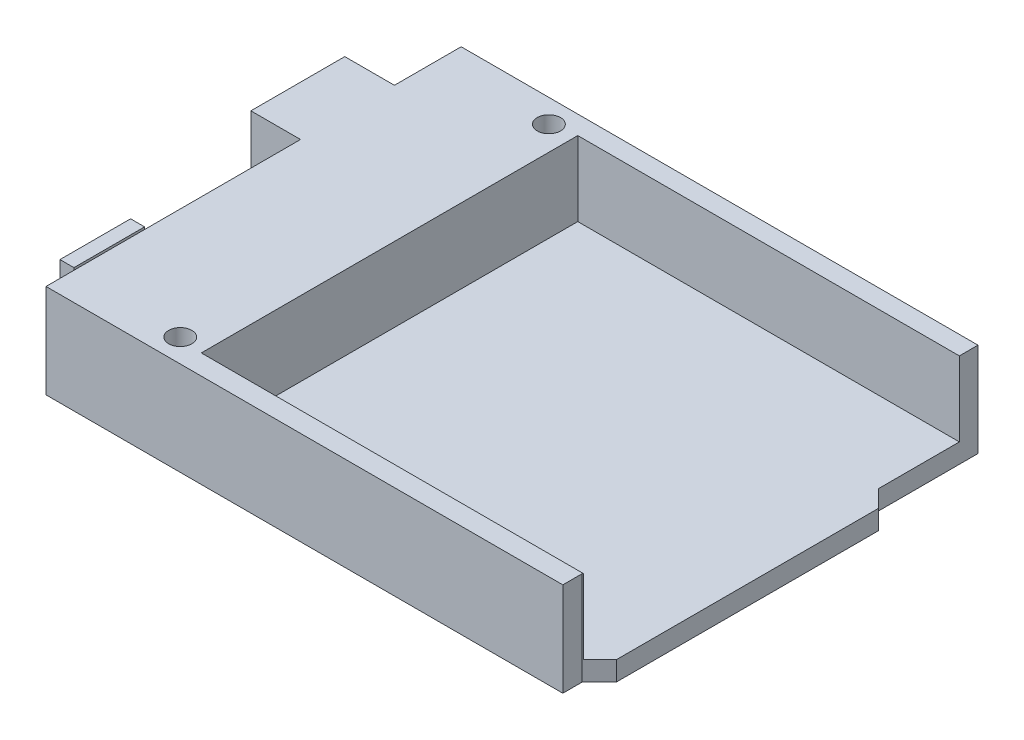
ISO-10303-21;
HEADER;
FILE_DESCRIPTION(('STEP AP214'),'2;1');
FILE_NAME('part.step','',(''),(''),'','','');
FILE_SCHEMA(('AUTOMOTIVE_DESIGN { 1 0 10303 214 1 1 1 1 }'));
ENDSEC;
DATA;
#1=APPLICATION_CONTEXT('core data for automotive mechanical design processes');
#2=APPLICATION_PROTOCOL_DEFINITION('international standard','automotive_design',2000,#1);
#3=PRODUCT_CONTEXT('',#1,'mechanical');
#4=PRODUCT('Part','Part','',(#3));
#5=PRODUCT_RELATED_PRODUCT_CATEGORY('part','',(#4));
#6=PRODUCT_DEFINITION_FORMATION('','',#4);
#7=PRODUCT_DEFINITION_CONTEXT('part definition',#1,'design');
#8=PRODUCT_DEFINITION('design','',#6,#7);
#9=PRODUCT_DEFINITION_SHAPE('','',#8);
#10=(LENGTH_UNIT() NAMED_UNIT(*) SI_UNIT(.MILLI.,.METRE.));
#11=(NAMED_UNIT(*) PLANE_ANGLE_UNIT() SI_UNIT($,.RADIAN.));
#12=(NAMED_UNIT(*) SI_UNIT($,.STERADIAN.) SOLID_ANGLE_UNIT());
#13=UNCERTAINTY_MEASURE_WITH_UNIT(LENGTH_MEASURE(1.E-05),#10,'distance_accuracy_value','');
#14=(GEOMETRIC_REPRESENTATION_CONTEXT(3) GLOBAL_UNCERTAINTY_ASSIGNED_CONTEXT((#13)) GLOBAL_UNIT_ASSIGNED_CONTEXT((#10,
#11,#12)) REPRESENTATION_CONTEXT('',''));
#15=CARTESIAN_POINT('',(0.,0.,0.));
#16=DIRECTION('',(0.,0.,1.));
#17=DIRECTION('',(1.,0.,0.));
#18=AXIS2_PLACEMENT_3D('',#15,#16,#17);
#19=CARTESIAN_POINT('',(0.,12.1,0.));
#20=DIRECTION('',(1.,0.,0.));
#21=DIRECTION('',(0.,0.,-1.));
#22=AXIS2_PLACEMENT_3D('',#19,#20,#21);
#23=PLANE('',#22);
#24=DIRECTION('',(0.,-1.,0.));
#25=VECTOR('',#24,1.);
#26=CARTESIAN_POINT('',(0.,12.4,-12.7));
#27=LINE('',#26,#25);
#28=CARTESIAN_POINT('',(0.,12.1,-12.7));
#29=VERTEX_POINT('',#28);
#30=CARTESIAN_POINT('',(0.,1.5,-12.7));
#31=VERTEX_POINT('',#30);
#32=EDGE_CURVE('E236',#29,#31,#27,.T.);
#33=ORIENTED_EDGE('',*,*,#32,.F.);
#34=DIRECTION('',(0.,0.,1.));
#35=VECTOR('',#34,1.);
#36=CARTESIAN_POINT('',(0.,12.1,0.));
#37=LINE('',#36,#35);
#38=CARTESIAN_POINT('',(0.,12.1,-32.8));
#39=VERTEX_POINT('',#38);
#40=EDGE_CURVE('E340',#39,#29,#37,.T.);
#41=ORIENTED_EDGE('',*,*,#40,.F.);
#42=DIRECTION('',(0.,1.,0.));
#43=VECTOR('',#42,1.);
#44=CARTESIAN_POINT('',(0.,12.1,-32.8));
#45=LINE('',#44,#43);
#46=CARTESIAN_POINT('',(0.,1.5,-32.8));
#47=VERTEX_POINT('',#46);
#48=EDGE_CURVE('E275',#47,#39,#45,.T.);
#49=ORIENTED_EDGE('',*,*,#48,.F.);
#50=DIRECTION('',(0.,0.,1.));
#51=VECTOR('',#50,1.);
#52=CARTESIAN_POINT('',(0.,1.5,-44.9));
#53=LINE('',#52,#51);
#54=CARTESIAN_POINT('',(0.,1.5,-44.9));
#55=VERTEX_POINT('',#54);
#56=EDGE_CURVE('E284',#55,#47,#53,.T.);
#57=ORIENTED_EDGE('',*,*,#56,.F.);
#58=DIRECTION('',(0.,-1.,0.));
#59=VECTOR('',#58,1.);
#60=CARTESIAN_POINT('',(0.,12.1,-44.9));
#61=LINE('',#60,#59);
#62=CARTESIAN_POINT('',(0.,12.1,-44.9));
#63=VERTEX_POINT('',#62);
#64=EDGE_CURVE('E270',#63,#55,#61,.T.);
#65=ORIENTED_EDGE('',*,*,#64,.F.);
#66=CARTESIAN_POINT('',(0.,12.1,-53.5));
#67=VERTEX_POINT('',#66);
#68=EDGE_CURVE('E336',#67,#63,#37,.T.);
#69=ORIENTED_EDGE('',*,*,#68,.F.);
#70=DIRECTION('',(0.,-1.,0.));
#71=VECTOR('',#70,1.);
#72=CARTESIAN_POINT('',(0.,12.1,-53.5));
#73=LINE('',#72,#71);
#74=CARTESIAN_POINT('',(0.,0.,-53.5));
#75=VERTEX_POINT('',#74);
#76=EDGE_CURVE('E346',#67,#75,#73,.T.);
#77=ORIENTED_EDGE('',*,*,#76,.T.);
#78=DIRECTION('',(0.,0.,1.));
#79=VECTOR('',#78,1.);
#80=CARTESIAN_POINT('',(0.,0.,0.));
#81=LINE('',#80,#79);
#82=CARTESIAN_POINT('',(0.,0.,0.));
#83=VERTEX_POINT('',#82);
#84=EDGE_CURVE('E321',#75,#83,#81,.T.);
#85=ORIENTED_EDGE('',*,*,#84,.T.);
#86=DIRECTION('',(0.,-1.,0.));
#87=VECTOR('',#86,1.);
#88=CARTESIAN_POINT('',(0.,12.1,0.));
#89=LINE('',#88,#87);
#90=CARTESIAN_POINT('',(0.,12.1,0.));
#91=VERTEX_POINT('',#90);
#92=EDGE_CURVE('E359',#91,#83,#89,.T.);
#93=ORIENTED_EDGE('',*,*,#92,.F.);
#94=CARTESIAN_POINT('',(0.,12.1,-3.6));
#95=VERTEX_POINT('',#94);
#96=EDGE_CURVE('E341',#95,#91,#37,.T.);
#97=ORIENTED_EDGE('',*,*,#96,.F.);
#98=DIRECTION('',(0.,1.,0.));
#99=VECTOR('',#98,1.);
#100=CARTESIAN_POINT('',(0.,12.4,-3.6));
#101=LINE('',#100,#99);
#102=CARTESIAN_POINT('',(0.,1.5,-3.6));
#103=VERTEX_POINT('',#102);
#104=EDGE_CURVE('E65',#103,#95,#101,.T.);
#105=ORIENTED_EDGE('',*,*,#104,.F.);
#106=DIRECTION('',(0.,0.,1.));
#107=VECTOR('',#106,1.);
#108=CARTESIAN_POINT('',(0.,1.5,-12.7));
#109=LINE('',#108,#107);
#110=EDGE_CURVE('E255',#31,#103,#109,.T.);
#111=ORIENTED_EDGE('',*,*,#110,.F.);
#112=EDGE_LOOP('',(#33,#41,#49,#57,#65,#69,#77,#85,#93,#97,#105,#111));
#113=FACE_BOUND('',#112,.T.);
#114=ADVANCED_FACE('F43',(#113),#23,.F.);
#115=CARTESIAN_POINT('',(0.,12.1,0.));
#116=DIRECTION('',(0.,0.,-1.));
#117=DIRECTION('',(-1.,0.,0.));
#118=AXIS2_PLACEMENT_3D('',#115,#116,#117);
#119=PLANE('',#118);
#120=DIRECTION('',(1.,0.,0.));
#121=VECTOR('',#120,1.);
#122=CARTESIAN_POINT('',(0.,0.,0.));
#123=LINE('',#122,#121);
#124=CARTESIAN_POINT('',(66.6,0.,0.));
#125=VERTEX_POINT('',#124);
#126=EDGE_CURVE('E349',#83,#125,#123,.T.);
#127=ORIENTED_EDGE('',*,*,#126,.T.);
#128=DIRECTION('',(0.,1.,0.));
#129=VECTOR('',#128,1.);
#130=CARTESIAN_POINT('',(66.6,-15.1604749265978,0.));
#131=LINE('',#130,#129);
#132=CARTESIAN_POINT('',(66.6,12.1,0.));
#133=VERTEX_POINT('',#132);
#134=EDGE_CURVE('E309',#125,#133,#131,.T.);
#135=ORIENTED_EDGE('',*,*,#134,.T.);
#136=DIRECTION('',(1.,0.,0.));
#137=VECTOR('',#136,1.);
#138=CARTESIAN_POINT('',(0.,12.1,0.));
#139=LINE('',#138,#137);
#140=EDGE_CURVE('E339',#91,#133,#139,.T.);
#141=ORIENTED_EDGE('',*,*,#140,.F.);
#142=ORIENTED_EDGE('',*,*,#92,.T.);
#143=EDGE_LOOP('',(#127,#135,#141,#142));
#144=FACE_BOUND('',#143,.T.);
#145=ADVANCED_FACE('F399',(#144),#119,.F.);
#146=CARTESIAN_POINT('',(68.8,12.1,0.));
#147=DIRECTION('',(-1.,0.,0.));
#148=DIRECTION('',(0.,0.,1.));
#149=AXIS2_PLACEMENT_3D('',#146,#147,#148);
#150=PLANE('',#149);
#151=DIRECTION('',(0.,1.,0.));
#152=VECTOR('',#151,1.);
#153=CARTESIAN_POINT('',(68.8,-15.1604749265978,-38.5));
#154=LINE('',#153,#152);
#155=CARTESIAN_POINT('',(68.8,0.,-38.5));
#156=VERTEX_POINT('',#155);
#157=CARTESIAN_POINT('',(68.8,2.5,-38.5));
#158=VERTEX_POINT('',#157);
#159=EDGE_CURVE('E326',#156,#158,#154,.T.);
#160=ORIENTED_EDGE('',*,*,#159,.T.);
#161=DIRECTION('',(0.,0.,1.));
#162=VECTOR('',#161,1.);
#163=CARTESIAN_POINT('',(68.8,2.5,0.));
#164=LINE('',#163,#162);
#165=CARTESIAN_POINT('',(68.8,2.5,-4.70000000000004));
#166=VERTEX_POINT('',#165);
#167=EDGE_CURVE('E219',#158,#166,#164,.T.);
#168=ORIENTED_EDGE('',*,*,#167,.T.);
#169=DIRECTION('',(0.,1.,0.));
#170=VECTOR('',#169,1.);
#171=CARTESIAN_POINT('',(68.8,-15.1604749265978,-4.70000000000004));
#172=LINE('',#171,#170);
#173=CARTESIAN_POINT('',(68.8,0.,-4.70000000000004));
#174=VERTEX_POINT('',#173);
#175=EDGE_CURVE('E314',#174,#166,#172,.T.);
#176=ORIENTED_EDGE('',*,*,#175,.F.);
#177=DIRECTION('',(0.,0.,-1.));
#178=VECTOR('',#177,1.);
#179=CARTESIAN_POINT('',(68.8,0.,0.));
#180=LINE('',#179,#178);
#181=EDGE_CURVE('E352',#174,#156,#180,.T.);
#182=ORIENTED_EDGE('',*,*,#181,.T.);
#183=EDGE_LOOP('',(#160,#168,#176,#182));
#184=FACE_BOUND('',#183,.T.);
#185=ADVANCED_FACE('F370',(#184),#150,.F.);
#186=CARTESIAN_POINT('',(0.,12.1,-53.5));
#187=DIRECTION('',(0.,0.,1.));
#188=DIRECTION('',(1.,0.,0.));
#189=AXIS2_PLACEMENT_3D('',#186,#187,#188);
#190=PLANE('',#189);
#191=DIRECTION('',(-1.,0.,0.));
#192=VECTOR('',#191,1.);
#193=CARTESIAN_POINT('',(0.,12.1,-53.5));
#194=LINE('',#193,#192);
#195=CARTESIAN_POINT('',(66.6,12.1,-53.5));
#196=VERTEX_POINT('',#195);
#197=EDGE_CURVE('E344',#196,#67,#194,.T.);
#198=ORIENTED_EDGE('',*,*,#197,.F.);
#199=DIRECTION('',(0.,1.,0.));
#200=VECTOR('',#199,1.);
#201=CARTESIAN_POINT('',(66.6,-15.1604749265978,-53.5));
#202=LINE('',#201,#200);
#203=CARTESIAN_POINT('',(66.6,0.,-53.5));
#204=VERTEX_POINT('',#203);
#205=EDGE_CURVE('E330',#204,#196,#202,.T.);
#206=ORIENTED_EDGE('',*,*,#205,.F.);
#207=DIRECTION('',(-1.,0.,0.));
#208=VECTOR('',#207,1.);
#209=CARTESIAN_POINT('',(0.,0.,-53.5));
#210=LINE('',#209,#208);
#211=EDGE_CURVE('E355',#204,#75,#210,.T.);
#212=ORIENTED_EDGE('',*,*,#211,.T.);
#213=ORIENTED_EDGE('',*,*,#76,.F.);
#214=EDGE_LOOP('',(#198,#206,#212,#213));
#215=FACE_BOUND('',#214,.T.);
#216=ADVANCED_FACE('F384',(#215),#190,.F.);
#217=CARTESIAN_POINT('',(0.,12.1,0.));
#218=DIRECTION('',(0.,-1.,0.));
#219=DIRECTION('',(0.,0.,-1.));
#220=AXIS2_PLACEMENT_3D('',#217,#218,#219);
#221=PLANE('',#220);
#222=DIRECTION('',(-0.707106781186539,0.,0.707106781186556));
#223=VECTOR('',#222,1.);
#224=CARTESIAN_POINT('',(32.0500000000008,12.1,32.05));
#225=LINE('',#224,#223);
#226=CARTESIAN_POINT('',(66.6865990462807,12.1,-2.58659904628065));
#227=VERTEX_POINT('',#226);
#228=CARTESIAN_POINT('',(66.6,12.1,-2.5));
#229=VERTEX_POINT('',#228);
#230=EDGE_CURVE('E304',#227,#229,#225,.T.);
#231=ORIENTED_EDGE('',*,*,#230,.F.);
#232=DIRECTION('',(1.,0.,0.));
#233=VECTOR('',#232,1.);
#234=CARTESIAN_POINT('',(17.4249588263836,12.1,-2.58659904628065));
#235=LINE('',#234,#233);
#236=CARTESIAN_POINT('',(17.4249588263836,12.1,-2.58659904628065));
#237=VERTEX_POINT('',#236);
#238=EDGE_CURVE('E57',#237,#227,#235,.T.);
#239=ORIENTED_EDGE('',*,*,#238,.F.);
#240=DIRECTION('',(0.,0.,1.));
#241=VECTOR('',#240,1.);
#242=CARTESIAN_POINT('',(17.4249588263836,12.1,-51.1));
#243=LINE('',#242,#241);
#244=CARTESIAN_POINT('',(17.4249588263836,12.1,-51.1));
#245=VERTEX_POINT('',#244);
#246=EDGE_CURVE('E202',#245,#237,#243,.T.);
#247=ORIENTED_EDGE('',*,*,#246,.F.);
#248=DIRECTION('',(-1.,0.,0.));
#249=VECTOR('',#248,1.);
#250=CARTESIAN_POINT('',(17.4249588263836,12.1,-51.1));
#251=LINE('',#250,#249);
#252=CARTESIAN_POINT('',(66.6,12.1,-51.1));
#253=VERTEX_POINT('',#252);
#254=EDGE_CURVE('E186',#253,#245,#251,.T.);
#255=ORIENTED_EDGE('',*,*,#254,.F.);
#256=DIRECTION('',(0.,0.,1.));
#257=VECTOR('',#256,1.);
#258=CARTESIAN_POINT('',(66.6,12.1,0.));
#259=LINE('',#258,#257);
#260=EDGE_CURVE('E300',#196,#253,#259,.T.);
#261=ORIENTED_EDGE('',*,*,#260,.F.);
#262=ORIENTED_EDGE('',*,*,#197,.T.);
#263=ORIENTED_EDGE('',*,*,#68,.T.);
#264=DIRECTION('',(1.,0.,0.));
#265=VECTOR('',#264,1.);
#266=CARTESIAN_POINT('',(-6.4,12.1,-44.9));
#267=LINE('',#266,#265);
#268=CARTESIAN_POINT('',(-6.4,12.1,-44.9));
#269=VERTEX_POINT('',#268);
#270=EDGE_CURVE('E281',#269,#63,#267,.T.);
#271=ORIENTED_EDGE('',*,*,#270,.F.);
#272=DIRECTION('',(0.,0.,-1.));
#273=VECTOR('',#272,1.);
#274=CARTESIAN_POINT('',(-6.4,12.1,-44.9));
#275=LINE('',#274,#273);
#276=CARTESIAN_POINT('',(-6.4,12.1,-32.8));
#277=VERTEX_POINT('',#276);
#278=EDGE_CURVE('E279',#277,#269,#275,.T.);
#279=ORIENTED_EDGE('',*,*,#278,.F.);
#280=DIRECTION('',(1.,0.,0.));
#281=VECTOR('',#280,1.);
#282=CARTESIAN_POINT('',(-6.4,12.1,-32.8));
#283=LINE('',#282,#281);
#284=EDGE_CURVE('E291',#277,#39,#283,.T.);
#285=ORIENTED_EDGE('',*,*,#284,.T.);
#286=ORIENTED_EDGE('',*,*,#40,.T.);
#287=EDGE_CURVE('E411',#29,#95,#37,.T.);
#288=ORIENTED_EDGE('',*,*,#287,.T.);
#289=ORIENTED_EDGE('',*,*,#96,.T.);
#290=ORIENTED_EDGE('',*,*,#140,.T.);
#291=DIRECTION('',(0.,0.,1.));
#292=VECTOR('',#291,1.);
#293=CARTESIAN_POINT('',(66.6,12.1,0.));
#294=LINE('',#293,#292);
#295=EDGE_CURVE('E301',#229,#133,#294,.T.);
#296=ORIENTED_EDGE('',*,*,#295,.F.);
#297=EDGE_LOOP('',(#231,#239,#247,#255,#261,#262,#263,#271,#279,#285,#286,#288,#289,#290,#296));
#298=FACE_BOUND('',#297,.T.);
#299=CARTESIAN_POINT('',(14.3,12.1,-50.5));
#300=DIRECTION('',(0.,1.,0.));
#301=DIRECTION('',(0.,0.,1.));
#302=AXIS2_PLACEMENT_3D('',#299,#300,#301);
#303=CIRCLE('',#302,1.5);
#304=CARTESIAN_POINT('',(14.3,12.1,-49.));
#305=VERTEX_POINT('',#304);
#306=EDGE_CURVE('E229',#305,#305,#303,.T.);
#307=ORIENTED_EDGE('',*,*,#306,.F.);
#308=EDGE_LOOP('',(#307));
#309=FACE_BOUND('',#308,.T.);
#310=CARTESIAN_POINT('',(14.3,12.1,-3.));
#311=DIRECTION('',(0.,1.,0.));
#312=DIRECTION('',(0.,0.,1.));
#313=AXIS2_PLACEMENT_3D('',#310,#311,#312);
#314=CIRCLE('',#313,1.5);
#315=CARTESIAN_POINT('',(14.3,12.1,-1.5));
#316=VERTEX_POINT('',#315);
#317=EDGE_CURVE('E233',#316,#316,#314,.T.);
#318=ORIENTED_EDGE('',*,*,#317,.F.);
#319=EDGE_LOOP('',(#318));
#320=FACE_BOUND('',#319,.T.);
#321=ADVANCED_FACE('F208',(#298,#309,#320),#221,.F.);
#322=CARTESIAN_POINT('',(0.,0.,0.));
#323=DIRECTION('',(0.,-1.,0.));
#324=DIRECTION('',(0.,0.,-1.));
#325=AXIS2_PLACEMENT_3D('',#322,#323,#324);
#326=PLANE('',#325);
#327=CARTESIAN_POINT('',(14.3,0.,-50.5));
#328=DIRECTION('',(0.,-1.,0.));
#329=DIRECTION('',(0.,0.,-1.));
#330=AXIS2_PLACEMENT_3D('',#327,#328,#329);
#331=CIRCLE('',#330,1.5);
#332=CARTESIAN_POINT('',(14.3,0.,-52.));
#333=VERTEX_POINT('',#332);
#334=EDGE_CURVE('E232',#333,#333,#331,.F.);
#335=ORIENTED_EDGE('',*,*,#334,.T.);
#336=EDGE_LOOP('',(#335));
#337=FACE_BOUND('',#336,.T.);
#338=CARTESIAN_POINT('',(14.3,0.,-3.));
#339=DIRECTION('',(0.,-1.,0.));
#340=DIRECTION('',(0.,0.,-1.));
#341=AXIS2_PLACEMENT_3D('',#338,#339,#340);
#342=CIRCLE('',#341,1.5);
#343=CARTESIAN_POINT('',(14.3,0.,-4.5));
#344=VERTEX_POINT('',#343);
#345=EDGE_CURVE('E228',#344,#344,#342,.F.);
#346=ORIENTED_EDGE('',*,*,#345,.T.);
#347=EDGE_LOOP('',(#346));
#348=FACE_BOUND('',#347,.T.);
#349=DIRECTION('',(0.,0.,1.));
#350=VECTOR('',#349,1.);
#351=CARTESIAN_POINT('',(66.6,0.,0.));
#352=LINE('',#351,#350);
#353=CARTESIAN_POINT('',(66.6,0.,-2.5));
#354=VERTEX_POINT('',#353);
#355=EDGE_CURVE('E303',#354,#125,#352,.T.);
#356=ORIENTED_EDGE('',*,*,#355,.T.);
#357=ORIENTED_EDGE('',*,*,#126,.F.);
#358=ORIENTED_EDGE('',*,*,#84,.F.);
#359=ORIENTED_EDGE('',*,*,#211,.F.);
#360=DIRECTION('',(0.,0.,1.));
#361=VECTOR('',#360,1.);
#362=CARTESIAN_POINT('',(66.6,0.,0.));
#363=LINE('',#362,#361);
#364=CARTESIAN_POINT('',(66.6,0.,-40.7));
#365=VERTEX_POINT('',#364);
#366=EDGE_CURVE('E327',#204,#365,#363,.T.);
#367=ORIENTED_EDGE('',*,*,#366,.T.);
#368=DIRECTION('',(0.707106781186544,0.,0.707106781186551));
#369=VECTOR('',#368,1.);
#370=CARTESIAN_POINT('',(53.6500000000003,0.,-53.6499999999998));
#371=LINE('',#370,#369);
#372=EDGE_CURVE('E323',#365,#156,#371,.T.);
#373=ORIENTED_EDGE('',*,*,#372,.T.);
#374=ORIENTED_EDGE('',*,*,#181,.F.);
#375=DIRECTION('',(-0.707106781186539,0.,0.707106781186556));
#376=VECTOR('',#375,1.);
#377=CARTESIAN_POINT('',(32.0500000000008,0.,32.05));
#378=LINE('',#377,#376);
#379=EDGE_CURVE('E310',#174,#354,#378,.T.);
#380=ORIENTED_EDGE('',*,*,#379,.T.);
#381=EDGE_LOOP('',(#356,#357,#358,#359,#367,#373,#374,#380));
#382=FACE_BOUND('',#381,.T.);
#383=ADVANCED_FACE('F376',(#337,#348,#382),#326,.T.);
#384=CARTESIAN_POINT('',(53.6500000000003,-15.1604749265978,-53.6499999999998));
#385=DIRECTION('',(-0.707106781186551,0.,0.707106781186544));
#386=DIRECTION('',(0.707106781186544,0.,0.707106781186551));
#387=AXIS2_PLACEMENT_3D('',#384,#385,#386);
#388=PLANE('',#387);
#389=DIRECTION('',(0.,1.,0.));
#390=VECTOR('',#389,1.);
#391=CARTESIAN_POINT('',(66.6,-15.1604749265978,-40.7));
#392=LINE('',#391,#390);
#393=CARTESIAN_POINT('',(66.6,2.5,-40.7));
#394=VERTEX_POINT('',#393);
#395=EDGE_CURVE('E306',#365,#394,#392,.T.);
#396=ORIENTED_EDGE('',*,*,#395,.T.);
#397=DIRECTION('',(0.707106781186544,0.,0.707106781186551));
#398=VECTOR('',#397,1.);
#399=CARTESIAN_POINT('',(53.6500000000003,2.5,-53.6499999999998));
#400=LINE('',#399,#398);
#401=EDGE_CURVE('E222',#394,#158,#400,.T.);
#402=ORIENTED_EDGE('',*,*,#401,.T.);
#403=ORIENTED_EDGE('',*,*,#159,.F.);
#404=ORIENTED_EDGE('',*,*,#372,.F.);
#405=EDGE_LOOP('',(#396,#402,#403,#404));
#406=FACE_BOUND('',#405,.T.);
#407=ADVANCED_FACE('F374',(#406),#388,.F.);
#408=CARTESIAN_POINT('',(66.6,-15.1604749265978,0.));
#409=DIRECTION('',(-1.,0.,0.));
#410=DIRECTION('',(0.,0.,1.));
#411=AXIS2_PLACEMENT_3D('',#408,#409,#410);
#412=PLANE('',#411);
#413=DIRECTION('',(0.,-1.,0.));
#414=VECTOR('',#413,1.);
#415=CARTESIAN_POINT('',(66.6,-15.1604749265978,-51.1));
#416=LINE('',#415,#414);
#417=CARTESIAN_POINT('',(66.6,2.5,-51.1));
#418=VERTEX_POINT('',#417);
#419=EDGE_CURVE('E13',#253,#418,#416,.T.);
#420=ORIENTED_EDGE('',*,*,#419,.T.);
#421=DIRECTION('',(0.,0.,1.));
#422=VECTOR('',#421,1.);
#423=CARTESIAN_POINT('',(66.6,2.5,0.));
#424=LINE('',#423,#422);
#425=EDGE_CURVE('E225',#418,#394,#424,.T.);
#426=ORIENTED_EDGE('',*,*,#425,.T.);
#427=ORIENTED_EDGE('',*,*,#395,.F.);
#428=ORIENTED_EDGE('',*,*,#366,.F.);
#429=ORIENTED_EDGE('',*,*,#205,.T.);
#430=ORIENTED_EDGE('',*,*,#260,.T.);
#431=EDGE_LOOP('',(#420,#426,#427,#428,#429,#430));
#432=FACE_BOUND('',#431,.T.);
#433=ADVANCED_FACE('F381',(#432),#412,.F.);
#434=CARTESIAN_POINT('',(66.6,-15.1604749265978,0.));
#435=DIRECTION('',(-1.,0.,0.));
#436=DIRECTION('',(0.,0.,1.));
#437=AXIS2_PLACEMENT_3D('',#434,#435,#436);
#438=PLANE('',#437);
#439=DIRECTION('',(0.,1.,0.));
#440=VECTOR('',#439,1.);
#441=CARTESIAN_POINT('',(66.6,-15.1604749265978,-2.5));
#442=LINE('',#441,#440);
#443=EDGE_CURVE('E313',#354,#229,#442,.T.);
#444=ORIENTED_EDGE('',*,*,#443,.T.);
#445=ORIENTED_EDGE('',*,*,#295,.T.);
#446=ORIENTED_EDGE('',*,*,#134,.F.);
#447=ORIENTED_EDGE('',*,*,#355,.F.);
#448=EDGE_LOOP('',(#444,#445,#446,#447));
#449=FACE_BOUND('',#448,.T.);
#450=ADVANCED_FACE('F420',(#449),#438,.F.);
#451=CARTESIAN_POINT('',(32.0500000000008,-15.1604749265978,32.05));
#452=DIRECTION('',(-0.707106781186556,0.,-0.707106781186539));
#453=DIRECTION('',(-0.707106781186539,0.,0.707106781186556));
#454=AXIS2_PLACEMENT_3D('',#451,#452,#453);
#455=PLANE('',#454);
#456=ORIENTED_EDGE('',*,*,#175,.T.);
#457=DIRECTION('',(-0.707106781186539,0.,0.707106781186556));
#458=VECTOR('',#457,1.);
#459=CARTESIAN_POINT('',(32.0500000000008,2.5,32.05));
#460=LINE('',#459,#458);
#461=CARTESIAN_POINT('',(66.6865990462807,2.5,-2.58659904628065));
#462=VERTEX_POINT('',#461);
#463=EDGE_CURVE('E50',#166,#462,#460,.T.);
#464=ORIENTED_EDGE('',*,*,#463,.T.);
#465=DIRECTION('',(0.,1.,0.));
#466=VECTOR('',#465,1.);
#467=CARTESIAN_POINT('',(66.6865990462807,-15.1604749265978,-2.58659904628065));
#468=LINE('',#467,#466);
#469=EDGE_CURVE('E362',#462,#227,#468,.T.);
#470=ORIENTED_EDGE('',*,*,#469,.T.);
#471=ORIENTED_EDGE('',*,*,#230,.T.);
#472=ORIENTED_EDGE('',*,*,#443,.F.);
#473=ORIENTED_EDGE('',*,*,#379,.F.);
#474=EDGE_LOOP('',(#456,#464,#470,#471,#472,#473));
#475=FACE_BOUND('',#474,.T.);
#476=ADVANCED_FACE('F365',(#475),#455,.F.);
#477=CARTESIAN_POINT('',(-6.4,12.1,-44.9));
#478=DIRECTION('',(0.,0.,1.));
#479=DIRECTION('',(1.,0.,0.));
#480=AXIS2_PLACEMENT_3D('',#477,#478,#479);
#481=PLANE('',#480);
#482=ORIENTED_EDGE('',*,*,#64,.T.);
#483=DIRECTION('',(1.,0.,0.));
#484=VECTOR('',#483,1.);
#485=CARTESIAN_POINT('',(-6.4,1.5,-44.9));
#486=LINE('',#485,#484);
#487=CARTESIAN_POINT('',(-6.4,1.5,-44.9));
#488=VERTEX_POINT('',#487);
#489=EDGE_CURVE('E297',#488,#55,#486,.T.);
#490=ORIENTED_EDGE('',*,*,#489,.F.);
#491=DIRECTION('',(0.,-1.,0.));
#492=VECTOR('',#491,1.);
#493=CARTESIAN_POINT('',(-6.4,12.1,-44.9));
#494=LINE('',#493,#492);
#495=EDGE_CURVE('E271',#269,#488,#494,.T.);
#496=ORIENTED_EDGE('',*,*,#495,.F.);
#497=ORIENTED_EDGE('',*,*,#270,.T.);
#498=EDGE_LOOP('',(#482,#490,#496,#497));
#499=FACE_BOUND('',#498,.T.);
#500=ADVANCED_FACE('F427',(#499),#481,.F.);
#501=CARTESIAN_POINT('',(-6.4,1.5,-44.9));
#502=DIRECTION('',(0.,1.,0.));
#503=DIRECTION('',(0.,0.,1.));
#504=AXIS2_PLACEMENT_3D('',#501,#502,#503);
#505=PLANE('',#504);
#506=ORIENTED_EDGE('',*,*,#56,.T.);
#507=DIRECTION('',(1.,0.,0.));
#508=VECTOR('',#507,1.);
#509=CARTESIAN_POINT('',(-6.4,1.5,-32.8));
#510=LINE('',#509,#508);
#511=CARTESIAN_POINT('',(-6.4,1.5,-32.8));
#512=VERTEX_POINT('',#511);
#513=EDGE_CURVE('E294',#512,#47,#510,.T.);
#514=ORIENTED_EDGE('',*,*,#513,.F.);
#515=DIRECTION('',(0.,0.,1.));
#516=VECTOR('',#515,1.);
#517=CARTESIAN_POINT('',(-6.4,1.5,-44.9));
#518=LINE('',#517,#516);
#519=EDGE_CURVE('E274',#488,#512,#518,.T.);
#520=ORIENTED_EDGE('',*,*,#519,.F.);
#521=ORIENTED_EDGE('',*,*,#489,.T.);
#522=EDGE_LOOP('',(#506,#514,#520,#521));
#523=FACE_BOUND('',#522,.T.);
#524=ADVANCED_FACE('F617',(#523),#505,.F.);
#525=CARTESIAN_POINT('',(-6.4,12.1,-32.8));
#526=DIRECTION('',(0.,0.,-1.));
#527=DIRECTION('',(-1.,0.,0.));
#528=AXIS2_PLACEMENT_3D('',#525,#526,#527);
#529=PLANE('',#528);
#530=ORIENTED_EDGE('',*,*,#48,.T.);
#531=ORIENTED_EDGE('',*,*,#284,.F.);
#532=DIRECTION('',(0.,1.,0.));
#533=VECTOR('',#532,1.);
#534=CARTESIAN_POINT('',(-6.4,12.1,-32.8));
#535=LINE('',#534,#533);
#536=EDGE_CURVE('E277',#512,#277,#535,.T.);
#537=ORIENTED_EDGE('',*,*,#536,.F.);
#538=ORIENTED_EDGE('',*,*,#513,.T.);
#539=EDGE_LOOP('',(#530,#531,#537,#538));
#540=FACE_BOUND('',#539,.T.);
#541=ADVANCED_FACE('F607',(#540),#529,.F.);
#542=CARTESIAN_POINT('',(-6.4,0.,0.));
#543=DIRECTION('',(-1.,0.,0.));
#544=DIRECTION('',(0.,0.,1.));
#545=AXIS2_PLACEMENT_3D('',#542,#543,#544);
#546=PLANE('',#545);
#547=ORIENTED_EDGE('',*,*,#495,.T.);
#548=ORIENTED_EDGE('',*,*,#519,.T.);
#549=ORIENTED_EDGE('',*,*,#536,.T.);
#550=ORIENTED_EDGE('',*,*,#278,.T.);
#551=EDGE_LOOP('',(#547,#548,#549,#550));
#552=FACE_BOUND('',#551,.T.);
#553=ADVANCED_FACE('F591',(#552),#546,.T.);
#554=CARTESIAN_POINT('',(0.,0.,0.));
#555=DIRECTION('',(-1.,0.,0.));
#556=DIRECTION('',(0.,0.,1.));
#557=AXIS2_PLACEMENT_3D('',#554,#555,#556);
#558=PLANE('',#557);
#559=CARTESIAN_POINT('',(0.,12.4,-3.6));
#560=VERTEX_POINT('',#559);
#561=EDGE_CURVE('E257',#95,#560,#101,.T.);
#562=ORIENTED_EDGE('',*,*,#561,.F.);
#563=ORIENTED_EDGE('',*,*,#287,.F.);
#564=CARTESIAN_POINT('',(0.,12.4,-12.7));
#565=VERTEX_POINT('',#564);
#566=EDGE_CURVE('E252',#565,#29,#27,.T.);
#567=ORIENTED_EDGE('',*,*,#566,.F.);
#568=DIRECTION('',(0.,0.,-1.));
#569=VECTOR('',#568,1.);
#570=CARTESIAN_POINT('',(0.,12.4,-12.7));
#571=LINE('',#570,#569);
#572=EDGE_CURVE('E245',#560,#565,#571,.T.);
#573=ORIENTED_EDGE('',*,*,#572,.F.);
#574=EDGE_LOOP('',(#562,#563,#567,#573));
#575=FACE_BOUND('',#574,.T.);
#576=ADVANCED_FACE('F582',(#575),#558,.F.);
#577=CARTESIAN_POINT('',(-1.8,12.4,-12.7));
#578=DIRECTION('',(0.,0.,1.));
#579=DIRECTION('',(0.,-1.,0.));
#580=AXIS2_PLACEMENT_3D('',#577,#578,#579);
#581=PLANE('',#580);
#582=ORIENTED_EDGE('',*,*,#566,.T.);
#583=ORIENTED_EDGE('',*,*,#32,.T.);
#584=DIRECTION('',(1.,0.,0.));
#585=VECTOR('',#584,1.);
#586=CARTESIAN_POINT('',(-1.8,1.5,-12.7));
#587=LINE('',#586,#585);
#588=CARTESIAN_POINT('',(-1.8,1.5,-12.7));
#589=VERTEX_POINT('',#588);
#590=EDGE_CURVE('E267',#589,#31,#587,.T.);
#591=ORIENTED_EDGE('',*,*,#590,.F.);
#592=DIRECTION('',(0.,-1.,0.));
#593=VECTOR('',#592,1.);
#594=CARTESIAN_POINT('',(-1.8,12.4,-12.7));
#595=LINE('',#594,#593);
#596=CARTESIAN_POINT('',(-1.8,12.4,-12.7));
#597=VERTEX_POINT('',#596);
#598=EDGE_CURVE('E241',#597,#589,#595,.T.);
#599=ORIENTED_EDGE('',*,*,#598,.F.);
#600=DIRECTION('',(1.,0.,0.));
#601=VECTOR('',#600,1.);
#602=CARTESIAN_POINT('',(-1.8,12.4,-12.7));
#603=LINE('',#602,#601);
#604=EDGE_CURVE('E251',#597,#565,#603,.T.);
#605=ORIENTED_EDGE('',*,*,#604,.T.);
#606=EDGE_LOOP('',(#582,#583,#591,#599,#605));
#607=FACE_BOUND('',#606,.T.);
#608=ADVANCED_FACE('F572',(#607),#581,.F.);
#609=CARTESIAN_POINT('',(-1.8,1.5,-12.7));
#610=DIRECTION('',(0.,1.,0.));
#611=DIRECTION('',(0.,0.,1.));
#612=AXIS2_PLACEMENT_3D('',#609,#610,#611);
#613=PLANE('',#612);
#614=ORIENTED_EDGE('',*,*,#110,.T.);
#615=DIRECTION('',(1.,0.,0.));
#616=VECTOR('',#615,1.);
#617=CARTESIAN_POINT('',(-1.8,1.5,-3.6));
#618=LINE('',#617,#616);
#619=CARTESIAN_POINT('',(-1.8,1.5,-3.6));
#620=VERTEX_POINT('',#619);
#621=EDGE_CURVE('E265',#620,#103,#618,.T.);
#622=ORIENTED_EDGE('',*,*,#621,.F.);
#623=DIRECTION('',(0.,0.,1.));
#624=VECTOR('',#623,1.);
#625=CARTESIAN_POINT('',(-1.8,1.5,-12.7));
#626=LINE('',#625,#624);
#627=EDGE_CURVE('E244',#589,#620,#626,.T.);
#628=ORIENTED_EDGE('',*,*,#627,.F.);
#629=ORIENTED_EDGE('',*,*,#590,.T.);
#630=EDGE_LOOP('',(#614,#622,#628,#629));
#631=FACE_BOUND('',#630,.T.);
#632=ADVANCED_FACE('F563',(#631),#613,.F.);
#633=CARTESIAN_POINT('',(-1.8,12.4,-3.6));
#634=DIRECTION('',(0.,0.,-1.));
#635=DIRECTION('',(0.,1.,0.));
#636=AXIS2_PLACEMENT_3D('',#633,#634,#635);
#637=PLANE('',#636);
#638=ORIENTED_EDGE('',*,*,#104,.T.);
#639=ORIENTED_EDGE('',*,*,#561,.T.);
#640=DIRECTION('',(1.,0.,0.));
#641=VECTOR('',#640,1.);
#642=CARTESIAN_POINT('',(-1.8,12.4,-3.6));
#643=LINE('',#642,#641);
#644=CARTESIAN_POINT('',(-1.8,12.4,-3.6));
#645=VERTEX_POINT('',#644);
#646=EDGE_CURVE('E262',#645,#560,#643,.T.);
#647=ORIENTED_EDGE('',*,*,#646,.F.);
#648=DIRECTION('',(0.,1.,0.));
#649=VECTOR('',#648,1.);
#650=CARTESIAN_POINT('',(-1.8,12.4,-3.6));
#651=LINE('',#650,#649);
#652=EDGE_CURVE('E247',#620,#645,#651,.T.);
#653=ORIENTED_EDGE('',*,*,#652,.F.);
#654=ORIENTED_EDGE('',*,*,#621,.T.);
#655=EDGE_LOOP('',(#638,#639,#647,#653,#654));
#656=FACE_BOUND('',#655,.T.);
#657=ADVANCED_FACE('F553',(#656),#637,.F.);
#658=CARTESIAN_POINT('',(-1.8,12.4,-12.7));
#659=DIRECTION('',(0.,-1.,0.));
#660=DIRECTION('',(0.,0.,-1.));
#661=AXIS2_PLACEMENT_3D('',#658,#659,#660);
#662=PLANE('',#661);
#663=ORIENTED_EDGE('',*,*,#572,.T.);
#664=ORIENTED_EDGE('',*,*,#604,.F.);
#665=DIRECTION('',(0.,0.,-1.));
#666=VECTOR('',#665,1.);
#667=CARTESIAN_POINT('',(-1.8,12.4,-12.7));
#668=LINE('',#667,#666);
#669=EDGE_CURVE('E249',#645,#597,#668,.T.);
#670=ORIENTED_EDGE('',*,*,#669,.F.);
#671=ORIENTED_EDGE('',*,*,#646,.T.);
#672=EDGE_LOOP('',(#663,#664,#670,#671));
#673=FACE_BOUND('',#672,.T.);
#674=ADVANCED_FACE('F544',(#673),#662,.F.);
#675=CARTESIAN_POINT('',(-1.8,0.,0.));
#676=DIRECTION('',(-1.,0.,0.));
#677=DIRECTION('',(0.,0.,1.));
#678=AXIS2_PLACEMENT_3D('',#675,#676,#677);
#679=PLANE('',#678);
#680=ORIENTED_EDGE('',*,*,#598,.T.);
#681=ORIENTED_EDGE('',*,*,#627,.T.);
#682=ORIENTED_EDGE('',*,*,#652,.T.);
#683=ORIENTED_EDGE('',*,*,#669,.T.);
#684=EDGE_LOOP('',(#680,#681,#682,#683));
#685=FACE_BOUND('',#684,.T.);
#686=ADVANCED_FACE('F535',(#685),#679,.T.);
#687=CARTESIAN_POINT('',(14.3,-4.24264068711929,-3.));
#688=DIRECTION('',(0.,1.,0.));
#689=DIRECTION('',(0.,0.,1.));
#690=AXIS2_PLACEMENT_3D('',#687,#688,#689);
#691=CYLINDRICAL_SURFACE('',#690,1.5);
#692=ORIENTED_EDGE('',*,*,#317,.T.);
#693=EDGE_LOOP('',(#692));
#694=FACE_BOUND('',#693,.T.);
#695=ORIENTED_EDGE('',*,*,#345,.F.);
#696=EDGE_LOOP('',(#695));
#697=FACE_BOUND('',#696,.T.);
#698=ADVANCED_FACE('F525',(#694,#697),#691,.F.);
#699=CARTESIAN_POINT('',(14.3,-4.24264068711929,-50.5));
#700=DIRECTION('',(0.,1.,0.));
#701=DIRECTION('',(0.,0.,1.));
#702=AXIS2_PLACEMENT_3D('',#699,#700,#701);
#703=CYLINDRICAL_SURFACE('',#702,1.5);
#704=ORIENTED_EDGE('',*,*,#306,.T.);
#705=EDGE_LOOP('',(#704));
#706=FACE_BOUND('',#705,.T.);
#707=ORIENTED_EDGE('',*,*,#334,.F.);
#708=EDGE_LOOP('',(#707));
#709=FACE_BOUND('',#708,.T.);
#710=ADVANCED_FACE('F493',(#706,#709),#703,.F.);
#711=CARTESIAN_POINT('',(17.4249588263836,-82.3281298693516,-51.1));
#712=DIRECTION('',(0.,0.,-1.));
#713=DIRECTION('',(-1.,0.,0.));
#714=AXIS2_PLACEMENT_3D('',#711,#712,#713);
#715=PLANE('',#714);
#716=ORIENTED_EDGE('',*,*,#254,.T.);
#717=DIRECTION('',(0.,1.,0.));
#718=VECTOR('',#717,1.);
#719=CARTESIAN_POINT('',(17.4249588263836,-82.3281298693516,-51.1));
#720=LINE('',#719,#718);
#721=CARTESIAN_POINT('',(17.4249588263836,2.5,-51.1));
#722=VERTEX_POINT('',#721);
#723=EDGE_CURVE('E190',#722,#245,#720,.T.);
#724=ORIENTED_EDGE('',*,*,#723,.F.);
#725=DIRECTION('',(-1.,0.,0.));
#726=VECTOR('',#725,1.);
#727=CARTESIAN_POINT('',(17.4249588263836,2.5,-51.1));
#728=LINE('',#727,#726);
#729=EDGE_CURVE('E205',#418,#722,#728,.T.);
#730=ORIENTED_EDGE('',*,*,#729,.F.);
#731=ORIENTED_EDGE('',*,*,#419,.F.);
#732=EDGE_LOOP('',(#716,#724,#730,#731));
#733=FACE_BOUND('',#732,.T.);
#734=ADVANCED_FACE('F188',(#733),#715,.F.);
#735=CARTESIAN_POINT('',(0.,2.5,0.));
#736=DIRECTION('',(0.,-1.,0.));
#737=DIRECTION('',(0.,0.,-1.));
#738=AXIS2_PLACEMENT_3D('',#735,#736,#737);
#739=PLANE('',#738);
#740=ORIENTED_EDGE('',*,*,#729,.T.);
#741=DIRECTION('',(0.,0.,1.));
#742=VECTOR('',#741,1.);
#743=CARTESIAN_POINT('',(17.4249588263836,2.5,-51.1));
#744=LINE('',#743,#742);
#745=CARTESIAN_POINT('',(17.4249588263836,2.5,-2.58659904628065));
#746=VERTEX_POINT('',#745);
#747=EDGE_CURVE('E204',#722,#746,#744,.T.);
#748=ORIENTED_EDGE('',*,*,#747,.T.);
#749=DIRECTION('',(1.,0.,0.));
#750=VECTOR('',#749,1.);
#751=CARTESIAN_POINT('',(17.4249588263836,2.5,-2.58659904628065));
#752=LINE('',#751,#750);
#753=EDGE_CURVE('E195',#746,#462,#752,.T.);
#754=ORIENTED_EDGE('',*,*,#753,.T.);
#755=ORIENTED_EDGE('',*,*,#463,.F.);
#756=ORIENTED_EDGE('',*,*,#167,.F.);
#757=ORIENTED_EDGE('',*,*,#401,.F.);
#758=ORIENTED_EDGE('',*,*,#425,.F.);
#759=EDGE_LOOP('',(#740,#748,#754,#755,#756,#757,#758));
#760=FACE_BOUND('',#759,.T.);
#761=ADVANCED_FACE('F368',(#760),#739,.F.);
#762=CARTESIAN_POINT('',(17.4249588263836,-82.3281298693516,-2.58659904628065));
#763=DIRECTION('',(0.,0.,1.));
#764=DIRECTION('',(1.,0.,0.));
#765=AXIS2_PLACEMENT_3D('',#762,#763,#764);
#766=PLANE('',#765);
#767=ORIENTED_EDGE('',*,*,#753,.F.);
#768=DIRECTION('',(0.,1.,0.));
#769=VECTOR('',#768,1.);
#770=CARTESIAN_POINT('',(17.4249588263836,-82.3281298693516,-2.58659904628065));
#771=LINE('',#770,#769);
#772=EDGE_CURVE('E216',#746,#237,#771,.T.);
#773=ORIENTED_EDGE('',*,*,#772,.T.);
#774=ORIENTED_EDGE('',*,*,#238,.T.);
#775=ORIENTED_EDGE('',*,*,#469,.F.);
#776=EDGE_LOOP('',(#767,#773,#774,#775));
#777=FACE_BOUND('',#776,.T.);
#778=ADVANCED_FACE('F388',(#777),#766,.F.);
#779=CARTESIAN_POINT('',(17.4249588263836,-82.3281298693516,-51.1));
#780=DIRECTION('',(-1.,0.,0.));
#781=DIRECTION('',(0.,0.,1.));
#782=AXIS2_PLACEMENT_3D('',#779,#780,#781);
#783=PLANE('',#782);
#784=ORIENTED_EDGE('',*,*,#723,.T.);
#785=ORIENTED_EDGE('',*,*,#246,.T.);
#786=ORIENTED_EDGE('',*,*,#772,.F.);
#787=ORIENTED_EDGE('',*,*,#747,.F.);
#788=EDGE_LOOP('',(#784,#785,#786,#787));
#789=FACE_BOUND('',#788,.T.);
#790=ADVANCED_FACE('F200',(#789),#783,.F.);
#791=CLOSED_SHELL('',(#114,#145,#185,#216,#321,#383,#407,#433,#450,#476,#500,#524,#541,#553,
#576,#608,#632,#657,#674,#686,#698,#710,#734,#761,#778,#790));
#792=MANIFOLD_SOLID_BREP('B2',#791);
#793=ADVANCED_BREP_SHAPE_REPRESENTATION('',(#18,#792),#14);
#794=SHAPE_DEFINITION_REPRESENTATION(#9,#793);
ENDSEC;
END-ISO-10303-21;
